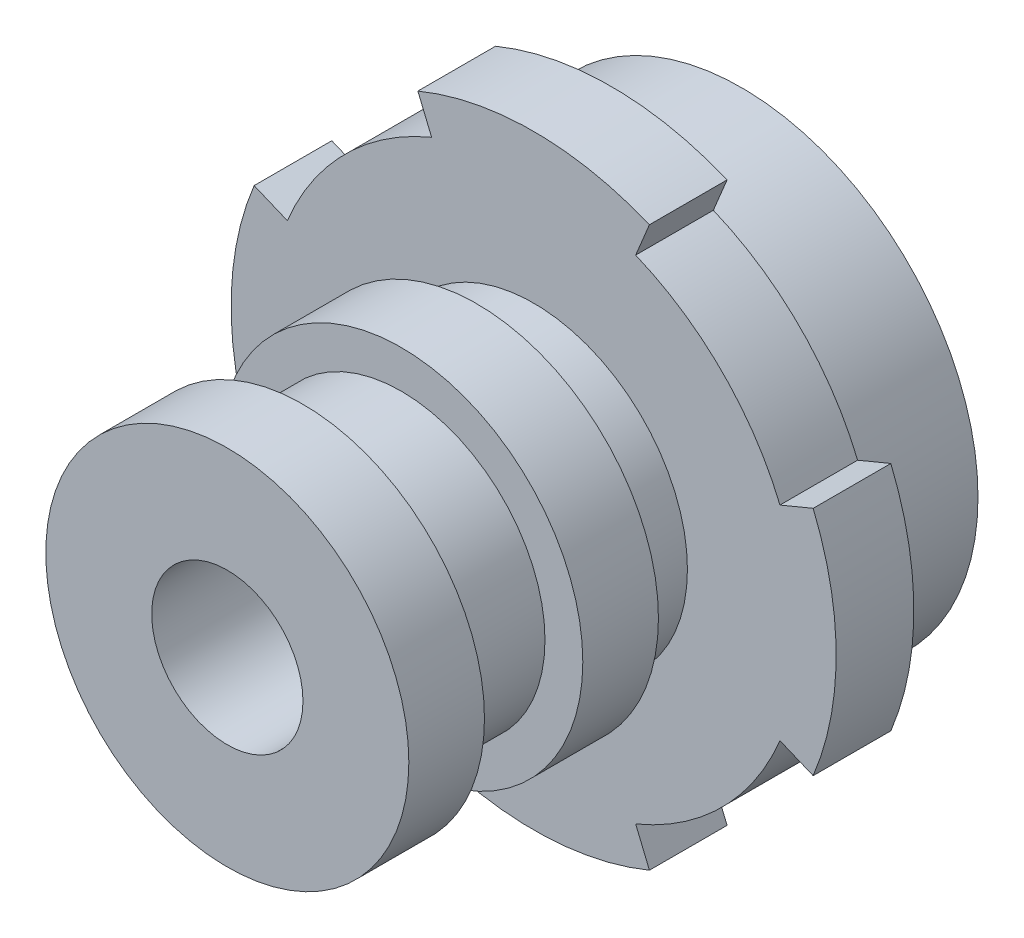
ISO-10303-21;
HEADER;
FILE_DESCRIPTION(('STEP AP214'),'2;1');
FILE_NAME('part.step','',(''),(''),'','','');
FILE_SCHEMA(('AUTOMOTIVE_DESIGN { 1 0 10303 214 1 1 1 1 }'));
ENDSEC;
DATA;
#1=APPLICATION_CONTEXT('core data for automotive mechanical design processes');
#2=APPLICATION_PROTOCOL_DEFINITION('international standard','automotive_design',2000,#1);
#3=PRODUCT_CONTEXT('',#1,'mechanical');
#4=PRODUCT('Part','Part','',(#3));
#5=PRODUCT_RELATED_PRODUCT_CATEGORY('part','',(#4));
#6=PRODUCT_DEFINITION_FORMATION('','',#4);
#7=PRODUCT_DEFINITION_CONTEXT('part definition',#1,'design');
#8=PRODUCT_DEFINITION('design','',#6,#7);
#9=PRODUCT_DEFINITION_SHAPE('','',#8);
#10=(LENGTH_UNIT() NAMED_UNIT(*) SI_UNIT(.MILLI.,.METRE.));
#11=(NAMED_UNIT(*) PLANE_ANGLE_UNIT() SI_UNIT($,.RADIAN.));
#12=(NAMED_UNIT(*) SI_UNIT($,.STERADIAN.) SOLID_ANGLE_UNIT());
#13=UNCERTAINTY_MEASURE_WITH_UNIT(LENGTH_MEASURE(1.E-05),#10,'distance_accuracy_value','');
#14=(GEOMETRIC_REPRESENTATION_CONTEXT(3) GLOBAL_UNCERTAINTY_ASSIGNED_CONTEXT((#13)) GLOBAL_UNIT_ASSIGNED_CONTEXT((#10,
#11,#12)) REPRESENTATION_CONTEXT('',''));
#15=CARTESIAN_POINT('',(0.,0.,0.));
#16=DIRECTION('',(0.,0.,1.));
#17=DIRECTION('',(1.,0.,0.));
#18=AXIS2_PLACEMENT_3D('',#15,#16,#17);
#19=CARTESIAN_POINT('',(0.,62.5,-60.7179487179488));
#20=DIRECTION('',(0.,0.,1.));
#21=DIRECTION('',(1.,0.,0.));
#22=AXIS2_PLACEMENT_3D('',#19,#20,#21);
#23=PLANE('',#22);
#24=CARTESIAN_POINT('',(0.,0.,-60.7179487179488));
#25=DIRECTION('',(0.,0.,1.));
#26=DIRECTION('',(1.,0.,0.));
#27=AXIS2_PLACEMENT_3D('',#24,#25,#26);
#28=CIRCLE('',#27,62.5);
#29=CARTESIAN_POINT('',(62.5,0.,-60.7179487179488));
#30=VERTEX_POINT('',#29);
#31=EDGE_CURVE('E306',#30,#30,#28,.T.);
#32=ORIENTED_EDGE('',*,*,#31,.T.);
#33=EDGE_LOOP('',(#32));
#34=FACE_BOUND('',#33,.T.);
#35=DIRECTION('',(-0.923879532511288,-0.382683432365087,0.));
#36=VECTOR('',#35,1.);
#37=CARTESIAN_POINT('',(0.,0.,-60.7179487179488));
#38=LINE('',#37,#36);
#39=CARTESIAN_POINT('',(-65.1335070420458,-26.9791819817386,-60.7179487179488));
#40=VERTEX_POINT('',#39);
#41=CARTESIAN_POINT('',(-73.910362600903,-30.614674589207,-60.7179487179488));
#42=VERTEX_POINT('',#41);
#43=EDGE_CURVE('E167',#40,#42,#38,.T.);
#44=ORIENTED_EDGE('',*,*,#43,.T.);
#45=CARTESIAN_POINT('',(0.,0.,-60.7179487179488));
#46=DIRECTION('',(0.,0.,1.));
#47=DIRECTION('',(1.,0.,0.));
#48=AXIS2_PLACEMENT_3D('',#45,#46,#47);
#49=CIRCLE('',#48,80.);
#50=CARTESIAN_POINT('',(-73.9103626009029,30.6146745892072,-60.7179487179488));
#51=VERTEX_POINT('',#50);
#52=EDGE_CURVE('E302',#51,#42,#49,.T.);
#53=ORIENTED_EDGE('',*,*,#52,.F.);
#54=DIRECTION('',(-0.923879532511287,0.38268343236509,0.));
#55=VECTOR('',#54,1.);
#56=CARTESIAN_POINT('',(0.,0.,-60.7179487179488));
#57=LINE('',#56,#55);
#58=CARTESIAN_POINT('',(-65.1335070420457,26.9791819817389,-60.7179487179488));
#59=VERTEX_POINT('',#58);
#60=EDGE_CURVE('E242',#59,#51,#57,.T.);
#61=ORIENTED_EDGE('',*,*,#60,.F.);
#62=CARTESIAN_POINT('',(0.,0.,-60.7179487179488));
#63=DIRECTION('',(0.,0.,-1.));
#64=DIRECTION('',(-1.,0.,0.));
#65=AXIS2_PLACEMENT_3D('',#62,#63,#64);
#66=CIRCLE('',#65,70.5);
#67=CARTESIAN_POINT('',(-26.9791819817384,65.1335070420459,-60.7179487179488));
#68=VERTEX_POINT('',#67);
#69=EDGE_CURVE('E191',#59,#68,#66,.T.);
#70=ORIENTED_EDGE('',*,*,#69,.T.);
#71=DIRECTION('',(-0.382683432365084,0.923879532511289,0.));
#72=VECTOR('',#71,1.);
#73=CARTESIAN_POINT('',(0.,0.,-60.7179487179488));
#74=LINE('',#73,#72);
#75=CARTESIAN_POINT('',(-30.6146745892067,73.9103626009031,-60.7179487179488));
#76=VERTEX_POINT('',#75);
#77=EDGE_CURVE('E245',#68,#76,#74,.T.);
#78=ORIENTED_EDGE('',*,*,#77,.T.);
#79=CARTESIAN_POINT('',(30.6146745892065,73.9103626009032,-60.7179487179488));
#80=VERTEX_POINT('',#79);
#81=EDGE_CURVE('E300',#80,#76,#49,.T.);
#82=ORIENTED_EDGE('',*,*,#81,.F.);
#83=DIRECTION('',(0.382683432365081,0.923879532511291,0.));
#84=VECTOR('',#83,1.);
#85=CARTESIAN_POINT('',(0.,0.,-60.7179487179488));
#86=LINE('',#85,#84);
#87=CARTESIAN_POINT('',(26.9791819817382,65.133507042046,-60.7179487179488));
#88=VERTEX_POINT('',#87);
#89=EDGE_CURVE('E222',#88,#80,#86,.T.);
#90=ORIENTED_EDGE('',*,*,#89,.F.);
#91=CARTESIAN_POINT('',(0.,0.,-60.7179487179488));
#92=DIRECTION('',(0.,0.,-1.));
#93=DIRECTION('',(0.,1.,0.));
#94=AXIS2_PLACEMENT_3D('',#91,#92,#93);
#95=CIRCLE('',#94,70.5);
#96=CARTESIAN_POINT('',(65.1335070420456,26.9791819817391,-60.7179487179488));
#97=VERTEX_POINT('',#96);
#98=EDGE_CURVE('E218',#88,#97,#95,.T.);
#99=ORIENTED_EDGE('',*,*,#98,.T.);
#100=DIRECTION('',(0.923879532511285,0.382683432365094,0.));
#101=VECTOR('',#100,1.);
#102=CARTESIAN_POINT('',(0.,0.,-60.7179487179488));
#103=LINE('',#102,#101);
#104=CARTESIAN_POINT('',(73.9103626009028,30.6146745892075,-60.7179487179488));
#105=VERTEX_POINT('',#104);
#106=EDGE_CURVE('E225',#97,#105,#103,.T.);
#107=ORIENTED_EDGE('',*,*,#106,.T.);
#108=CARTESIAN_POINT('',(73.9103626009029,-30.6146745892072,-60.7179487179488));
#109=VERTEX_POINT('',#108);
#110=EDGE_CURVE('E389',#109,#105,#49,.T.);
#111=ORIENTED_EDGE('',*,*,#110,.F.);
#112=DIRECTION('',(0.923879532511287,-0.38268343236509,0.));
#113=VECTOR('',#112,1.);
#114=CARTESIAN_POINT('',(0.,0.,-60.7179487179488));
#115=LINE('',#114,#113);
#116=CARTESIAN_POINT('',(65.1335070420457,-26.9791819817389,-60.7179487179488));
#117=VERTEX_POINT('',#116);
#118=EDGE_CURVE('E201',#117,#109,#115,.T.);
#119=ORIENTED_EDGE('',*,*,#118,.F.);
#120=CARTESIAN_POINT('',(0.,0.,-60.7179487179488));
#121=DIRECTION('',(0.,0.,-1.));
#122=DIRECTION('',(1.,0.,0.));
#123=AXIS2_PLACEMENT_3D('',#120,#121,#122);
#124=CIRCLE('',#123,70.5);
#125=CARTESIAN_POINT('',(26.9791819817384,-65.1335070420459,-60.7179487179488));
#126=VERTEX_POINT('',#125);
#127=EDGE_CURVE('E197',#117,#126,#124,.T.);
#128=ORIENTED_EDGE('',*,*,#127,.T.);
#129=DIRECTION('',(0.382683432365084,-0.923879532511289,0.));
#130=VECTOR('',#129,1.);
#131=CARTESIAN_POINT('',(0.,0.,-60.7179487179488));
#132=LINE('',#131,#130);
#133=CARTESIAN_POINT('',(30.6146745892067,-73.9103626009031,-60.7179487179488));
#134=VERTEX_POINT('',#133);
#135=EDGE_CURVE('E205',#126,#134,#132,.T.);
#136=ORIENTED_EDGE('',*,*,#135,.T.);
#137=CARTESIAN_POINT('',(-30.614674589207,-73.910362600903,-60.7179487179488));
#138=VERTEX_POINT('',#137);
#139=EDGE_CURVE('E183',#138,#134,#49,.T.);
#140=ORIENTED_EDGE('',*,*,#139,.F.);
#141=DIRECTION('',(-0.382683432365087,-0.923879532511288,0.));
#142=VECTOR('',#141,1.);
#143=CARTESIAN_POINT('',(0.,0.,-60.7179487179488));
#144=LINE('',#143,#142);
#145=CARTESIAN_POINT('',(-26.9791819817387,-65.1335070420458,-60.7179487179488));
#146=VERTEX_POINT('',#145);
#147=EDGE_CURVE('E159',#146,#138,#144,.T.);
#148=ORIENTED_EDGE('',*,*,#147,.F.);
#149=CARTESIAN_POINT('',(0.,0.,-60.7179487179488));
#150=DIRECTION('',(0.,0.,-1.));
#151=DIRECTION('',(0.,-1.,0.));
#152=AXIS2_PLACEMENT_3D('',#149,#150,#151);
#153=CIRCLE('',#152,70.5);
#154=EDGE_CURVE('E170',#146,#40,#153,.T.);
#155=ORIENTED_EDGE('',*,*,#154,.T.);
#156=EDGE_LOOP('',(#44,#53,#61,#70,#78,#82,#90,#99,#107,#111,#119,#128,#136,#140,#148,#155));
#157=FACE_BOUND('',#156,.T.);
#158=ADVANCED_FACE('F43',(#34,#157),#23,.F.);
#159=CARTESIAN_POINT('',(0.,0.,49.0256410256411));
#160=DIRECTION('',(0.,0.,1.));
#161=DIRECTION('',(1.,0.,0.));
#162=AXIS2_PLACEMENT_3D('',#159,#160,#161);
#163=CYLINDRICAL_SURFACE('',#162,80.);
#164=DIRECTION('',(0.,0.,-1.));
#165=VECTOR('',#164,1.);
#166=CARTESIAN_POINT('',(-73.910362600903,-30.614674589207,40.8205128205129));
#167=LINE('',#166,#165);
#168=CARTESIAN_POINT('',(-73.910362600903,-30.614674589207,-40.1794871794872));
#169=VERTEX_POINT('',#168);
#170=EDGE_CURVE('E192',#169,#42,#167,.T.);
#171=ORIENTED_EDGE('',*,*,#170,.F.);
#172=CARTESIAN_POINT('',(0.,0.,-40.1794871794871));
#173=DIRECTION('',(0.,0.,1.));
#174=DIRECTION('',(1.,0.,0.));
#175=AXIS2_PLACEMENT_3D('',#172,#173,#174);
#176=CIRCLE('',#175,80.);
#177=CARTESIAN_POINT('',(-73.9103626009029,30.6146745892072,-40.1794871794871));
#178=VERTEX_POINT('',#177);
#179=EDGE_CURVE('E296',#178,#169,#176,.T.);
#180=ORIENTED_EDGE('',*,*,#179,.F.);
#181=DIRECTION('',(0.,0.,-1.));
#182=VECTOR('',#181,1.);
#183=CARTESIAN_POINT('',(-73.9103626009029,30.6146745892072,40.8205128205129));
#184=LINE('',#183,#182);
#185=EDGE_CURVE('E258',#178,#51,#184,.T.);
#186=ORIENTED_EDGE('',*,*,#185,.T.);
#187=ORIENTED_EDGE('',*,*,#52,.T.);
#188=EDGE_LOOP('',(#171,#180,#186,#187));
#189=FACE_BOUND('',#188,.T.);
#190=ADVANCED_FACE('F370',(#189),#163,.T.);
#191=CARTESIAN_POINT('',(-30.614674589207,-73.910362600903,-40.1794871794871));
#192=VERTEX_POINT('',#191);
#193=CARTESIAN_POINT('',(30.6146745892067,-73.9103626009031,-40.1794871794872));
#194=VERTEX_POINT('',#193);
#195=EDGE_CURVE('E301',#192,#194,#176,.T.);
#196=ORIENTED_EDGE('',*,*,#195,.F.);
#197=DIRECTION('',(0.,0.,-1.));
#198=VECTOR('',#197,1.);
#199=CARTESIAN_POINT('',(-30.614674589207,-73.910362600903,40.8205128205129));
#200=LINE('',#199,#198);
#201=EDGE_CURVE('E166',#192,#138,#200,.T.);
#202=ORIENTED_EDGE('',*,*,#201,.T.);
#203=ORIENTED_EDGE('',*,*,#139,.T.);
#204=DIRECTION('',(0.,0.,-1.));
#205=VECTOR('',#204,1.);
#206=CARTESIAN_POINT('',(30.6146745892067,-73.9103626009031,40.8205128205129));
#207=LINE('',#206,#205);
#208=EDGE_CURVE('E211',#194,#134,#207,.T.);
#209=ORIENTED_EDGE('',*,*,#208,.F.);
#210=EDGE_LOOP('',(#196,#202,#203,#209));
#211=FACE_BOUND('',#210,.T.);
#212=ADVANCED_FACE('F399',(#211),#163,.T.);
#213=CARTESIAN_POINT('',(73.9103626009029,-30.6146745892072,-40.1794871794871));
#214=VERTEX_POINT('',#213);
#215=CARTESIAN_POINT('',(73.9103626009028,30.6146745892075,-40.1794871794872));
#216=VERTEX_POINT('',#215);
#217=EDGE_CURVE('E404',#214,#216,#176,.T.);
#218=ORIENTED_EDGE('',*,*,#217,.F.);
#219=DIRECTION('',(0.,0.,-1.));
#220=VECTOR('',#219,1.);
#221=CARTESIAN_POINT('',(73.9103626009029,-30.6146745892072,40.8205128205129));
#222=LINE('',#221,#220);
#223=EDGE_CURVE('E67',#214,#109,#222,.T.);
#224=ORIENTED_EDGE('',*,*,#223,.T.);
#225=ORIENTED_EDGE('',*,*,#110,.T.);
#226=DIRECTION('',(0.,0.,-1.));
#227=VECTOR('',#226,1.);
#228=CARTESIAN_POINT('',(73.9103626009028,30.6146745892075,40.8205128205129));
#229=LINE('',#228,#227);
#230=EDGE_CURVE('E232',#216,#105,#229,.T.);
#231=ORIENTED_EDGE('',*,*,#230,.F.);
#232=EDGE_LOOP('',(#218,#224,#225,#231));
#233=FACE_BOUND('',#232,.T.);
#234=ADVANCED_FACE('F415',(#233),#163,.T.);
#235=CARTESIAN_POINT('',(0.,80.,-40.1794871794871));
#236=DIRECTION('',(0.,0.,-1.));
#237=DIRECTION('',(-1.,0.,0.));
#238=AXIS2_PLACEMENT_3D('',#235,#236,#237);
#239=PLANE('',#238);
#240=CARTESIAN_POINT('',(0.,0.,-40.1794871794871));
#241=DIRECTION('',(0.,0.,1.));
#242=DIRECTION('',(1.,0.,0.));
#243=AXIS2_PLACEMENT_3D('',#240,#241,#242);
#244=CIRCLE('',#243,40.6666666666667);
#245=CARTESIAN_POINT('',(40.6666666666667,0.,-40.1794871794871));
#246=VERTEX_POINT('',#245);
#247=EDGE_CURVE('E291',#246,#246,#244,.T.);
#248=ORIENTED_EDGE('',*,*,#247,.F.);
#249=EDGE_LOOP('',(#248));
#250=FACE_BOUND('',#249,.T.);
#251=DIRECTION('',(-0.923879532511288,-0.382683432365087,0.));
#252=VECTOR('',#251,1.);
#253=CARTESIAN_POINT('',(28.2842712474617,11.7157287525379,-40.1794871794871));
#254=LINE('',#253,#252);
#255=CARTESIAN_POINT('',(-65.1335070420458,-26.9791819817386,-40.1794871794872));
#256=VERTEX_POINT('',#255);
#257=EDGE_CURVE('E11',#256,#169,#254,.T.);
#258=ORIENTED_EDGE('',*,*,#257,.F.);
#259=CARTESIAN_POINT('',(0.,0.,-40.1794871794872));
#260=DIRECTION('',(0.,0.,-1.));
#261=DIRECTION('',(-1.,0.,0.));
#262=AXIS2_PLACEMENT_3D('',#259,#260,#261);
#263=CIRCLE('',#262,70.5);
#264=CARTESIAN_POINT('',(-26.9791819817387,-65.1335070420458,-40.1794871794872));
#265=VERTEX_POINT('',#264);
#266=EDGE_CURVE('E52',#265,#256,#263,.T.);
#267=ORIENTED_EDGE('',*,*,#266,.F.);
#268=DIRECTION('',(-0.382683432365087,-0.923879532511288,0.));
#269=VECTOR('',#268,1.);
#270=CARTESIAN_POINT('',(28.2842712474617,68.2842712474621,-40.1794871794871));
#271=LINE('',#270,#269);
#272=EDGE_CURVE('E162',#265,#192,#271,.T.);
#273=ORIENTED_EDGE('',*,*,#272,.T.);
#274=ORIENTED_EDGE('',*,*,#195,.T.);
#275=DIRECTION('',(0.382683432365084,-0.923879532511289,0.));
#276=VECTOR('',#275,1.);
#277=CARTESIAN_POINT('',(-28.2842712474615,68.2842712474623,-40.1794871794871));
#278=LINE('',#277,#276);
#279=CARTESIAN_POINT('',(26.9791819817384,-65.1335070420459,-40.1794871794872));
#280=VERTEX_POINT('',#279);
#281=EDGE_CURVE('E356',#280,#194,#278,.T.);
#282=ORIENTED_EDGE('',*,*,#281,.F.);
#283=CARTESIAN_POINT('',(0.,0.,-40.1794871794872));
#284=DIRECTION('',(0.,0.,-1.));
#285=DIRECTION('',(-1.,0.,0.));
#286=AXIS2_PLACEMENT_3D('',#283,#284,#285);
#287=CIRCLE('',#286,70.5);
#288=CARTESIAN_POINT('',(65.1335070420457,-26.9791819817389,-40.1794871794872));
#289=VERTEX_POINT('',#288);
#290=EDGE_CURVE('E353',#289,#280,#287,.T.);
#291=ORIENTED_EDGE('',*,*,#290,.F.);
#292=DIRECTION('',(0.923879532511287,-0.38268343236509,0.));
#293=VECTOR('',#292,1.);
#294=CARTESIAN_POINT('',(-28.2842712474619,11.7157287525381,-40.1794871794871));
#295=LINE('',#294,#293);
#296=EDGE_CURVE('E350',#289,#214,#295,.T.);
#297=ORIENTED_EDGE('',*,*,#296,.T.);
#298=ORIENTED_EDGE('',*,*,#217,.T.);
#299=DIRECTION('',(0.923879532511285,0.382683432365094,0.));
#300=VECTOR('',#299,1.);
#301=CARTESIAN_POINT('',(28.2842712474621,11.7157287525383,-40.1794871794871));
#302=LINE('',#301,#300);
#303=CARTESIAN_POINT('',(65.1335070420456,26.9791819817391,-40.1794871794872));
#304=VERTEX_POINT('',#303);
#305=EDGE_CURVE('E347',#304,#216,#302,.T.);
#306=ORIENTED_EDGE('',*,*,#305,.F.);
#307=CARTESIAN_POINT('',(0.,0.,-40.1794871794872));
#308=DIRECTION('',(0.,0.,-1.));
#309=DIRECTION('',(-1.,0.,0.));
#310=AXIS2_PLACEMENT_3D('',#307,#308,#309);
#311=CIRCLE('',#310,70.5);
#312=CARTESIAN_POINT('',(26.9791819817382,65.133507042046,-40.1794871794872));
#313=VERTEX_POINT('',#312);
#314=EDGE_CURVE('E344',#313,#304,#311,.T.);
#315=ORIENTED_EDGE('',*,*,#314,.F.);
#316=DIRECTION('',(0.382683432365081,0.923879532511291,0.));
#317=VECTOR('',#316,1.);
#318=CARTESIAN_POINT('',(28.2842712474614,68.2842712474625,-40.1794871794871));
#319=LINE('',#318,#317);
#320=CARTESIAN_POINT('',(30.6146745892065,73.9103626009032,-40.1794871794871));
#321=VERTEX_POINT('',#320);
#322=EDGE_CURVE('E341',#313,#321,#319,.T.);
#323=ORIENTED_EDGE('',*,*,#322,.T.);
#324=CARTESIAN_POINT('',(-30.6146745892067,73.9103626009031,-40.1794871794872));
#325=VERTEX_POINT('',#324);
#326=EDGE_CURVE('E295',#321,#325,#176,.T.);
#327=ORIENTED_EDGE('',*,*,#326,.T.);
#328=DIRECTION('',(-0.382683432365084,0.923879532511289,0.));
#329=VECTOR('',#328,1.);
#330=CARTESIAN_POINT('',(-28.2842712474615,68.2842712474623,-40.1794871794871));
#331=LINE('',#330,#329);
#332=CARTESIAN_POINT('',(-26.9791819817384,65.1335070420459,-40.1794871794872));
#333=VERTEX_POINT('',#332);
#334=EDGE_CURVE('E337',#333,#325,#331,.T.);
#335=ORIENTED_EDGE('',*,*,#334,.F.);
#336=CARTESIAN_POINT('',(0.,0.,-40.1794871794872));
#337=DIRECTION('',(0.,0.,-1.));
#338=DIRECTION('',(-1.,0.,0.));
#339=AXIS2_PLACEMENT_3D('',#336,#337,#338);
#340=CIRCLE('',#339,70.5);
#341=CARTESIAN_POINT('',(-65.1335070420457,26.9791819817389,-40.1794871794872));
#342=VERTEX_POINT('',#341);
#343=EDGE_CURVE('E334',#342,#333,#340,.T.);
#344=ORIENTED_EDGE('',*,*,#343,.F.);
#345=DIRECTION('',(-0.923879532511287,0.38268343236509,0.));
#346=VECTOR('',#345,1.);
#347=CARTESIAN_POINT('',(-28.2842712474619,11.7157287525381,-40.1794871794871));
#348=LINE('',#347,#346);
#349=EDGE_CURVE('E330',#342,#178,#348,.T.);
#350=ORIENTED_EDGE('',*,*,#349,.T.);
#351=ORIENTED_EDGE('',*,*,#179,.T.);
#352=EDGE_LOOP('',(#258,#267,#273,#274,#282,#291,#297,#298,#306,#315,#323,#327,#335,#344,#350,#351));
#353=FACE_BOUND('',#352,.T.);
#354=ADVANCED_FACE('F366',(#250,#353),#239,.F.);
#355=ORIENTED_EDGE('',*,*,#326,.F.);
#356=DIRECTION('',(0.,0.,-1.));
#357=VECTOR('',#356,1.);
#358=CARTESIAN_POINT('',(30.6146745892065,73.9103626009032,40.8205128205129));
#359=LINE('',#358,#357);
#360=EDGE_CURVE('E59',#321,#80,#359,.T.);
#361=ORIENTED_EDGE('',*,*,#360,.T.);
#362=ORIENTED_EDGE('',*,*,#81,.T.);
#363=DIRECTION('',(0.,0.,-1.));
#364=VECTOR('',#363,1.);
#365=CARTESIAN_POINT('',(-30.6146745892067,73.9103626009031,40.8205128205129));
#366=LINE('',#365,#364);
#367=EDGE_CURVE('E254',#325,#76,#366,.T.);
#368=ORIENTED_EDGE('',*,*,#367,.F.);
#369=EDGE_LOOP('',(#355,#361,#362,#368));
#370=FACE_BOUND('',#369,.T.);
#371=ADVANCED_FACE('F412',(#370),#163,.T.);
#372=CARTESIAN_POINT('',(0.,48.,40.8205128205129));
#373=DIRECTION('',(0.,0.,-1.));
#374=DIRECTION('',(-1.,0.,0.));
#375=AXIS2_PLACEMENT_3D('',#372,#373,#374);
#376=PLANE('',#375);
#377=CARTESIAN_POINT('',(0.,0.,40.8205128205129));
#378=DIRECTION('',(0.,0.,1.));
#379=DIRECTION('',(1.,0.,0.));
#380=AXIS2_PLACEMENT_3D('',#377,#378,#379);
#381=CIRCLE('',#380,20.);
#382=CARTESIAN_POINT('',(20.,0.,40.8205128205129));
#383=VERTEX_POINT('',#382);
#384=EDGE_CURVE('E326',#383,#383,#381,.T.);
#385=ORIENTED_EDGE('',*,*,#384,.F.);
#386=EDGE_LOOP('',(#385));
#387=FACE_BOUND('',#386,.T.);
#388=CARTESIAN_POINT('',(0.,0.,40.8205128205129));
#389=DIRECTION('',(0.,0.,1.));
#390=DIRECTION('',(1.,0.,0.));
#391=AXIS2_PLACEMENT_3D('',#388,#389,#390);
#392=CIRCLE('',#391,48.);
#393=CARTESIAN_POINT('',(48.,0.,40.8205128205129));
#394=VERTEX_POINT('',#393);
#395=EDGE_CURVE('E253',#394,#394,#392,.T.);
#396=ORIENTED_EDGE('',*,*,#395,.T.);
#397=EDGE_LOOP('',(#396));
#398=FACE_BOUND('',#397,.T.);
#399=ADVANCED_FACE('F45',(#387,#398),#376,.F.);
#400=CARTESIAN_POINT('',(0.,0.,49.0256410256411));
#401=DIRECTION('',(0.,0.,1.));
#402=DIRECTION('',(1.,0.,0.));
#403=AXIS2_PLACEMENT_3D('',#400,#401,#402);
#404=CYLINDRICAL_SURFACE('',#403,20.);
#405=CARTESIAN_POINT('',(0.,0.,-65.1794871794871));
#406=DIRECTION('',(0.,0.,1.));
#407=DIRECTION('',(1.,0.,0.));
#408=AXIS2_PLACEMENT_3D('',#405,#406,#407);
#409=CIRCLE('',#408,20.);
#410=CARTESIAN_POINT('',(20.,0.,-65.1794871794871));
#411=VERTEX_POINT('',#410);
#412=EDGE_CURVE('E322',#411,#411,#409,.T.);
#413=ORIENTED_EDGE('',*,*,#412,.F.);
#414=EDGE_LOOP('',(#413));
#415=FACE_BOUND('',#414,.T.);
#416=ORIENTED_EDGE('',*,*,#384,.T.);
#417=EDGE_LOOP('',(#416));
#418=FACE_BOUND('',#417,.T.);
#419=ADVANCED_FACE('F420',(#415,#418),#404,.F.);
#420=CARTESIAN_POINT('',(0.,20.,-65.1794871794871));
#421=DIRECTION('',(0.,0.,1.));
#422=DIRECTION('',(1.,0.,0.));
#423=AXIS2_PLACEMENT_3D('',#420,#421,#422);
#424=PLANE('',#423);
#425=CARTESIAN_POINT('',(0.,0.,-65.1794871794871));
#426=DIRECTION('',(0.,0.,1.));
#427=DIRECTION('',(1.,0.,0.));
#428=AXIS2_PLACEMENT_3D('',#425,#426,#427);
#429=CIRCLE('',#428,48.);
#430=CARTESIAN_POINT('',(48.,0.,-65.1794871794871));
#431=VERTEX_POINT('',#430);
#432=EDGE_CURVE('E318',#431,#431,#429,.T.);
#433=ORIENTED_EDGE('',*,*,#432,.F.);
#434=EDGE_LOOP('',(#433));
#435=FACE_BOUND('',#434,.T.);
#436=ORIENTED_EDGE('',*,*,#412,.T.);
#437=EDGE_LOOP('',(#436));
#438=FACE_BOUND('',#437,.T.);
#439=ADVANCED_FACE('F444',(#435,#438),#424,.F.);
#440=CARTESIAN_POINT('',(0.,0.,49.0256410256411));
#441=DIRECTION('',(0.,0.,1.));
#442=DIRECTION('',(1.,0.,0.));
#443=AXIS2_PLACEMENT_3D('',#440,#441,#442);
#444=CYLINDRICAL_SURFACE('',#443,48.);
#445=CARTESIAN_POINT('',(0.,0.,-95.1794871794871));
#446=DIRECTION('',(0.,0.,1.));
#447=DIRECTION('',(1.,0.,0.));
#448=AXIS2_PLACEMENT_3D('',#445,#446,#447);
#449=CIRCLE('',#448,48.);
#450=CARTESIAN_POINT('',(48.,0.,-95.1794871794871));
#451=VERTEX_POINT('',#450);
#452=EDGE_CURVE('E314',#451,#451,#449,.T.);
#453=ORIENTED_EDGE('',*,*,#452,.F.);
#454=EDGE_LOOP('',(#453));
#455=FACE_BOUND('',#454,.T.);
#456=ORIENTED_EDGE('',*,*,#432,.T.);
#457=EDGE_LOOP('',(#456));
#458=FACE_BOUND('',#457,.T.);
#459=ADVANCED_FACE('F440',(#455,#458),#444,.F.);
#460=CARTESIAN_POINT('',(0.,48.,-95.1794871794871));
#461=DIRECTION('',(0.,0.,1.));
#462=DIRECTION('',(1.,0.,0.));
#463=AXIS2_PLACEMENT_3D('',#460,#461,#462);
#464=PLANE('',#463);
#465=CARTESIAN_POINT('',(0.,0.,-95.1794871794871));
#466=DIRECTION('',(0.,0.,1.));
#467=DIRECTION('',(1.,0.,0.));
#468=AXIS2_PLACEMENT_3D('',#465,#466,#467);
#469=CIRCLE('',#468,62.5);
#470=CARTESIAN_POINT('',(62.5,0.,-95.1794871794871));
#471=VERTEX_POINT('',#470);
#472=EDGE_CURVE('E310',#471,#471,#469,.T.);
#473=ORIENTED_EDGE('',*,*,#472,.F.);
#474=EDGE_LOOP('',(#473));
#475=FACE_BOUND('',#474,.T.);
#476=ORIENTED_EDGE('',*,*,#452,.T.);
#477=EDGE_LOOP('',(#476));
#478=FACE_BOUND('',#477,.T.);
#479=ADVANCED_FACE('F436',(#475,#478),#464,.F.);
#480=CARTESIAN_POINT('',(0.,0.,49.0256410256411));
#481=DIRECTION('',(0.,0.,1.));
#482=DIRECTION('',(1.,0.,0.));
#483=AXIS2_PLACEMENT_3D('',#480,#481,#482);
#484=CYLINDRICAL_SURFACE('',#483,62.5);
#485=ORIENTED_EDGE('',*,*,#31,.F.);
#486=EDGE_LOOP('',(#485));
#487=FACE_BOUND('',#486,.T.);
#488=ORIENTED_EDGE('',*,*,#472,.T.);
#489=EDGE_LOOP('',(#488));
#490=FACE_BOUND('',#489,.T.);
#491=ADVANCED_FACE('F432',(#487,#490),#484,.T.);
#492=CARTESIAN_POINT('',(0.,0.,49.0256410256411));
#493=DIRECTION('',(0.,0.,1.));
#494=DIRECTION('',(1.,0.,0.));
#495=AXIS2_PLACEMENT_3D('',#492,#493,#494);
#496=CYLINDRICAL_SURFACE('',#495,40.6666666666667);
#497=CARTESIAN_POINT('',(0.,0.,-25.1794871794871));
#498=DIRECTION('',(0.,0.,1.));
#499=DIRECTION('',(1.,0.,0.));
#500=AXIS2_PLACEMENT_3D('',#497,#498,#499);
#501=CIRCLE('',#500,40.6666666666667);
#502=CARTESIAN_POINT('',(40.6666666666667,0.,-25.1794871794871));
#503=VERTEX_POINT('',#502);
#504=EDGE_CURVE('E287',#503,#503,#501,.T.);
#505=ORIENTED_EDGE('',*,*,#504,.F.);
#506=EDGE_LOOP('',(#505));
#507=FACE_BOUND('',#506,.T.);
#508=ORIENTED_EDGE('',*,*,#247,.T.);
#509=EDGE_LOOP('',(#508));
#510=FACE_BOUND('',#509,.T.);
#511=ADVANCED_FACE('F435',(#507,#510),#496,.T.);
#512=CARTESIAN_POINT('',(0.,40.6666666666667,-25.1794871794871));
#513=DIRECTION('',(0.,0.,1.));
#514=DIRECTION('',(1.,0.,0.));
#515=AXIS2_PLACEMENT_3D('',#512,#513,#514);
#516=PLANE('',#515);
#517=CARTESIAN_POINT('',(0.,0.,-25.1794871794871));
#518=DIRECTION('',(0.,0.,1.));
#519=DIRECTION('',(1.,0.,0.));
#520=AXIS2_PLACEMENT_3D('',#517,#518,#519);
#521=CIRCLE('',#520,48.);
#522=CARTESIAN_POINT('',(48.,0.,-25.1794871794871));
#523=VERTEX_POINT('',#522);
#524=EDGE_CURVE('E283',#523,#523,#521,.T.);
#525=ORIENTED_EDGE('',*,*,#524,.F.);
#526=EDGE_LOOP('',(#525));
#527=FACE_BOUND('',#526,.T.);
#528=ORIENTED_EDGE('',*,*,#504,.T.);
#529=EDGE_LOOP('',(#528));
#530=FACE_BOUND('',#529,.T.);
#531=ADVANCED_FACE('F485',(#527,#530),#516,.F.);
#532=CARTESIAN_POINT('',(0.,0.,49.0256410256411));
#533=DIRECTION('',(0.,0.,1.));
#534=DIRECTION('',(1.,0.,0.));
#535=AXIS2_PLACEMENT_3D('',#532,#533,#534);
#536=CYLINDRICAL_SURFACE('',#535,48.);
#537=CARTESIAN_POINT('',(0.,0.,-5.17948717948714));
#538=DIRECTION('',(0.,0.,1.));
#539=DIRECTION('',(1.,0.,0.));
#540=AXIS2_PLACEMENT_3D('',#537,#538,#539);
#541=CIRCLE('',#540,48.);
#542=CARTESIAN_POINT('',(48.,0.,-5.17948717948714));
#543=VERTEX_POINT('',#542);
#544=EDGE_CURVE('E279',#543,#543,#541,.T.);
#545=ORIENTED_EDGE('',*,*,#544,.F.);
#546=EDGE_LOOP('',(#545));
#547=FACE_BOUND('',#546,.T.);
#548=ORIENTED_EDGE('',*,*,#524,.T.);
#549=EDGE_LOOP('',(#548));
#550=FACE_BOUND('',#549,.T.);
#551=ADVANCED_FACE('F479',(#547,#550),#536,.T.);
#552=CARTESIAN_POINT('',(0.,48.,-5.17948717948714));
#553=DIRECTION('',(0.,0.,-1.));
#554=DIRECTION('',(-1.,0.,0.));
#555=AXIS2_PLACEMENT_3D('',#552,#553,#554);
#556=PLANE('',#555);
#557=CARTESIAN_POINT('',(0.,0.,-5.17948717948714));
#558=DIRECTION('',(0.,0.,1.));
#559=DIRECTION('',(1.,0.,0.));
#560=AXIS2_PLACEMENT_3D('',#557,#558,#559);
#561=CIRCLE('',#560,38.);
#562=CARTESIAN_POINT('',(38.,0.,-5.17948717948714));
#563=VERTEX_POINT('',#562);
#564=EDGE_CURVE('E275',#563,#563,#561,.T.);
#565=ORIENTED_EDGE('',*,*,#564,.F.);
#566=EDGE_LOOP('',(#565));
#567=FACE_BOUND('',#566,.T.);
#568=ORIENTED_EDGE('',*,*,#544,.T.);
#569=EDGE_LOOP('',(#568));
#570=FACE_BOUND('',#569,.T.);
#571=ADVANCED_FACE('F473',(#567,#570),#556,.F.);
#572=CARTESIAN_POINT('',(0.,0.,49.0256410256411));
#573=DIRECTION('',(0.,0.,1.));
#574=DIRECTION('',(1.,0.,0.));
#575=AXIS2_PLACEMENT_3D('',#572,#573,#574);
#576=CYLINDRICAL_SURFACE('',#575,38.);
#577=CARTESIAN_POINT('',(0.,0.,20.8205128205129));
#578=DIRECTION('',(0.,0.,1.));
#579=DIRECTION('',(1.,0.,0.));
#580=AXIS2_PLACEMENT_3D('',#577,#578,#579);
#581=CIRCLE('',#580,38.);
#582=CARTESIAN_POINT('',(38.,0.,20.8205128205129));
#583=VERTEX_POINT('',#582);
#584=EDGE_CURVE('E271',#583,#583,#581,.T.);
#585=ORIENTED_EDGE('',*,*,#584,.F.);
#586=EDGE_LOOP('',(#585));
#587=FACE_BOUND('',#586,.T.);
#588=ORIENTED_EDGE('',*,*,#564,.T.);
#589=EDGE_LOOP('',(#588));
#590=FACE_BOUND('',#589,.T.);
#591=ADVANCED_FACE('F467',(#587,#590),#576,.T.);
#592=CARTESIAN_POINT('',(0.,38.,20.8205128205129));
#593=DIRECTION('',(0.,0.,1.));
#594=DIRECTION('',(1.,0.,0.));
#595=AXIS2_PLACEMENT_3D('',#592,#593,#594);
#596=PLANE('',#595);
#597=CARTESIAN_POINT('',(0.,0.,20.8205128205129));
#598=DIRECTION('',(0.,0.,1.));
#599=DIRECTION('',(1.,0.,0.));
#600=AXIS2_PLACEMENT_3D('',#597,#598,#599);
#601=CIRCLE('',#600,48.);
#602=CARTESIAN_POINT('',(48.,0.,20.8205128205129));
#603=VERTEX_POINT('',#602);
#604=EDGE_CURVE('E267',#603,#603,#601,.T.);
#605=ORIENTED_EDGE('',*,*,#604,.F.);
#606=EDGE_LOOP('',(#605));
#607=FACE_BOUND('',#606,.T.);
#608=ORIENTED_EDGE('',*,*,#584,.T.);
#609=EDGE_LOOP('',(#608));
#610=FACE_BOUND('',#609,.T.);
#611=ADVANCED_FACE('F461',(#607,#610),#596,.F.);
#612=CARTESIAN_POINT('',(0.,0.,49.0256410256411));
#613=DIRECTION('',(0.,0.,1.));
#614=DIRECTION('',(1.,0.,0.));
#615=AXIS2_PLACEMENT_3D('',#612,#613,#614);
#616=CYLINDRICAL_SURFACE('',#615,48.);
#617=ORIENTED_EDGE('',*,*,#395,.F.);
#618=EDGE_LOOP('',(#617));
#619=FACE_BOUND('',#618,.T.);
#620=ORIENTED_EDGE('',*,*,#604,.T.);
#621=EDGE_LOOP('',(#620));
#622=FACE_BOUND('',#621,.T.);
#623=ADVANCED_FACE('F458',(#619,#622),#616,.T.);
#624=CARTESIAN_POINT('',(0.,0.,40.8205128205129));
#625=DIRECTION('',(0.,0.,-1.));
#626=DIRECTION('',(-1.,0.,0.));
#627=AXIS2_PLACEMENT_3D('',#624,#625,#626);
#628=CYLINDRICAL_SURFACE('',#627,70.5);
#629=ORIENTED_EDGE('',*,*,#343,.T.);
#630=DIRECTION('',(0.,0.,-1.));
#631=VECTOR('',#630,1.);
#632=CARTESIAN_POINT('',(-26.9791819817384,65.1335070420459,40.8205128205129));
#633=LINE('',#632,#631);
#634=EDGE_CURVE('E250',#333,#68,#633,.T.);
#635=ORIENTED_EDGE('',*,*,#634,.T.);
#636=ORIENTED_EDGE('',*,*,#69,.F.);
#637=DIRECTION('',(0.,0.,-1.));
#638=VECTOR('',#637,1.);
#639=CARTESIAN_POINT('',(-65.1335070420457,26.9791819817389,40.8205128205129));
#640=LINE('',#639,#638);
#641=EDGE_CURVE('E249',#342,#59,#640,.T.);
#642=ORIENTED_EDGE('',*,*,#641,.F.);
#643=EDGE_LOOP('',(#629,#635,#636,#642));
#644=FACE_BOUND('',#643,.T.);
#645=ADVANCED_FACE('F378',(#644),#628,.T.);
#646=CARTESIAN_POINT('',(0.,0.,40.8205128205129));
#647=DIRECTION('',(-0.923879532511289,-0.382683432365084,0.));
#648=DIRECTION('',(0.382683432365084,-0.923879532511289,0.));
#649=AXIS2_PLACEMENT_3D('',#646,#647,#648);
#650=PLANE('',#649);
#651=ORIENTED_EDGE('',*,*,#334,.T.);
#652=ORIENTED_EDGE('',*,*,#367,.T.);
#653=ORIENTED_EDGE('',*,*,#77,.F.);
#654=ORIENTED_EDGE('',*,*,#634,.F.);
#655=EDGE_LOOP('',(#651,#652,#653,#654));
#656=FACE_BOUND('',#655,.T.);
#657=ADVANCED_FACE('F383',(#656),#650,.T.);
#658=CARTESIAN_POINT('',(0.,0.,40.8205128205129));
#659=DIRECTION('',(-0.38268343236509,-0.923879532511287,0.));
#660=DIRECTION('',(0.923879532511287,-0.38268343236509,0.));
#661=AXIS2_PLACEMENT_3D('',#658,#659,#660);
#662=PLANE('',#661);
#663=ORIENTED_EDGE('',*,*,#641,.T.);
#664=ORIENTED_EDGE('',*,*,#60,.T.);
#665=ORIENTED_EDGE('',*,*,#185,.F.);
#666=ORIENTED_EDGE('',*,*,#349,.F.);
#667=EDGE_LOOP('',(#663,#664,#665,#666));
#668=FACE_BOUND('',#667,.T.);
#669=ADVANCED_FACE('F375',(#668),#662,.F.);
#670=CARTESIAN_POINT('',(0.,0.,40.8205128205129));
#671=DIRECTION('',(0.,0.,-1.));
#672=DIRECTION('',(-1.,0.,0.));
#673=AXIS2_PLACEMENT_3D('',#670,#671,#672);
#674=CYLINDRICAL_SURFACE('',#673,70.5);
#675=ORIENTED_EDGE('',*,*,#314,.T.);
#676=DIRECTION('',(0.,0.,-1.));
#677=VECTOR('',#676,1.);
#678=CARTESIAN_POINT('',(65.1335070420456,26.9791819817391,40.8205128205129));
#679=LINE('',#678,#677);
#680=EDGE_CURVE('E202',#304,#97,#679,.T.);
#681=ORIENTED_EDGE('',*,*,#680,.T.);
#682=ORIENTED_EDGE('',*,*,#98,.F.);
#683=DIRECTION('',(0.,0.,-1.));
#684=VECTOR('',#683,1.);
#685=CARTESIAN_POINT('',(26.9791819817382,65.133507042046,40.8205128205129));
#686=LINE('',#685,#684);
#687=EDGE_CURVE('E229',#313,#88,#686,.T.);
#688=ORIENTED_EDGE('',*,*,#687,.F.);
#689=EDGE_LOOP('',(#675,#681,#682,#688));
#690=FACE_BOUND('',#689,.T.);
#691=ADVANCED_FACE('F505',(#690),#674,.T.);
#692=CARTESIAN_POINT('',(0.,0.,40.8205128205129));
#693=DIRECTION('',(-0.382683432365094,0.923879532511285,0.));
#694=DIRECTION('',(-0.923879532511285,-0.382683432365094,0.));
#695=AXIS2_PLACEMENT_3D('',#692,#693,#694);
#696=PLANE('',#695);
#697=ORIENTED_EDGE('',*,*,#305,.T.);
#698=ORIENTED_EDGE('',*,*,#230,.T.);
#699=ORIENTED_EDGE('',*,*,#106,.F.);
#700=ORIENTED_EDGE('',*,*,#680,.F.);
#701=EDGE_LOOP('',(#697,#698,#699,#700));
#702=FACE_BOUND('',#701,.T.);
#703=ADVANCED_FACE('F510',(#702),#696,.T.);
#704=CARTESIAN_POINT('',(0.,0.,40.8205128205129));
#705=DIRECTION('',(-0.923879532511291,0.382683432365081,0.));
#706=DIRECTION('',(-0.382683432365081,-0.923879532511291,0.));
#707=AXIS2_PLACEMENT_3D('',#704,#705,#706);
#708=PLANE('',#707);
#709=ORIENTED_EDGE('',*,*,#687,.T.);
#710=ORIENTED_EDGE('',*,*,#89,.T.);
#711=ORIENTED_EDGE('',*,*,#360,.F.);
#712=ORIENTED_EDGE('',*,*,#322,.F.);
#713=EDGE_LOOP('',(#709,#710,#711,#712));
#714=FACE_BOUND('',#713,.T.);
#715=ADVANCED_FACE('F512',(#714),#708,.F.);
#716=CARTESIAN_POINT('',(0.,0.,40.8205128205129));
#717=DIRECTION('',(0.,0.,-1.));
#718=DIRECTION('',(-1.,0.,0.));
#719=AXIS2_PLACEMENT_3D('',#716,#717,#718);
#720=CYLINDRICAL_SURFACE('',#719,70.5);
#721=ORIENTED_EDGE('',*,*,#290,.T.);
#722=DIRECTION('',(0.,0.,-1.));
#723=VECTOR('',#722,1.);
#724=CARTESIAN_POINT('',(26.9791819817384,-65.1335070420459,40.8205128205129));
#725=LINE('',#724,#723);
#726=EDGE_CURVE('E178',#280,#126,#725,.T.);
#727=ORIENTED_EDGE('',*,*,#726,.T.);
#728=ORIENTED_EDGE('',*,*,#127,.F.);
#729=DIRECTION('',(0.,0.,-1.));
#730=VECTOR('',#729,1.);
#731=CARTESIAN_POINT('',(65.1335070420457,-26.9791819817389,40.8205128205129));
#732=LINE('',#731,#730);
#733=EDGE_CURVE('E208',#289,#117,#732,.T.);
#734=ORIENTED_EDGE('',*,*,#733,.F.);
#735=EDGE_LOOP('',(#721,#727,#728,#734));
#736=FACE_BOUND('',#735,.T.);
#737=ADVANCED_FACE('F515',(#736),#720,.T.);
#738=CARTESIAN_POINT('',(0.,0.,40.8205128205129));
#739=DIRECTION('',(0.923879532511289,0.382683432365084,0.));
#740=DIRECTION('',(-0.382683432365084,0.923879532511289,0.));
#741=AXIS2_PLACEMENT_3D('',#738,#739,#740);
#742=PLANE('',#741);
#743=ORIENTED_EDGE('',*,*,#281,.T.);
#744=ORIENTED_EDGE('',*,*,#208,.T.);
#745=ORIENTED_EDGE('',*,*,#135,.F.);
#746=ORIENTED_EDGE('',*,*,#726,.F.);
#747=EDGE_LOOP('',(#743,#744,#745,#746));
#748=FACE_BOUND('',#747,.T.);
#749=ADVANCED_FACE('F521',(#748),#742,.T.);
#750=CARTESIAN_POINT('',(0.,0.,40.8205128205129));
#751=DIRECTION('',(0.38268343236509,0.923879532511287,0.));
#752=DIRECTION('',(-0.923879532511287,0.38268343236509,0.));
#753=AXIS2_PLACEMENT_3D('',#750,#751,#752);
#754=PLANE('',#753);
#755=ORIENTED_EDGE('',*,*,#733,.T.);
#756=ORIENTED_EDGE('',*,*,#118,.T.);
#757=ORIENTED_EDGE('',*,*,#223,.F.);
#758=ORIENTED_EDGE('',*,*,#296,.F.);
#759=EDGE_LOOP('',(#755,#756,#757,#758));
#760=FACE_BOUND('',#759,.T.);
#761=ADVANCED_FACE('F523',(#760),#754,.F.);
#762=CARTESIAN_POINT('',(0.,0.,40.8205128205129));
#763=DIRECTION('',(0.,0.,-1.));
#764=DIRECTION('',(-1.,0.,0.));
#765=AXIS2_PLACEMENT_3D('',#762,#763,#764);
#766=CYLINDRICAL_SURFACE('',#765,70.5);
#767=ORIENTED_EDGE('',*,*,#266,.T.);
#768=DIRECTION('',(0.,0.,-1.));
#769=VECTOR('',#768,1.);
#770=CARTESIAN_POINT('',(-65.1335070420458,-26.9791819817386,40.8205128205129));
#771=LINE('',#770,#769);
#772=EDGE_CURVE('E173',#256,#40,#771,.T.);
#773=ORIENTED_EDGE('',*,*,#772,.T.);
#774=ORIENTED_EDGE('',*,*,#154,.F.);
#775=DIRECTION('',(0.,0.,-1.));
#776=VECTOR('',#775,1.);
#777=CARTESIAN_POINT('',(-26.9791819817387,-65.1335070420458,40.8205128205129));
#778=LINE('',#777,#776);
#779=EDGE_CURVE('E155',#265,#146,#778,.T.);
#780=ORIENTED_EDGE('',*,*,#779,.F.);
#781=EDGE_LOOP('',(#767,#773,#774,#780));
#782=FACE_BOUND('',#781,.T.);
#783=ADVANCED_FACE('F171',(#782),#766,.T.);
#784=CARTESIAN_POINT('',(0.,0.,40.8205128205129));
#785=DIRECTION('',(0.382683432365087,-0.923879532511288,0.));
#786=DIRECTION('',(0.923879532511288,0.382683432365087,0.));
#787=AXIS2_PLACEMENT_3D('',#784,#785,#786);
#788=PLANE('',#787);
#789=ORIENTED_EDGE('',*,*,#257,.T.);
#790=ORIENTED_EDGE('',*,*,#170,.T.);
#791=ORIENTED_EDGE('',*,*,#43,.F.);
#792=ORIENTED_EDGE('',*,*,#772,.F.);
#793=EDGE_LOOP('',(#789,#790,#791,#792));
#794=FACE_BOUND('',#793,.T.);
#795=ADVANCED_FACE('F364',(#794),#788,.T.);
#796=CARTESIAN_POINT('',(0.,0.,40.8205128205129));
#797=DIRECTION('',(0.923879532511288,-0.382683432365087,0.));
#798=DIRECTION('',(0.382683432365087,0.923879532511288,0.));
#799=AXIS2_PLACEMENT_3D('',#796,#797,#798);
#800=PLANE('',#799);
#801=ORIENTED_EDGE('',*,*,#779,.T.);
#802=ORIENTED_EDGE('',*,*,#147,.T.);
#803=ORIENTED_EDGE('',*,*,#201,.F.);
#804=ORIENTED_EDGE('',*,*,#272,.F.);
#805=EDGE_LOOP('',(#801,#802,#803,#804));
#806=FACE_BOUND('',#805,.T.);
#807=ADVANCED_FACE('F157',(#806),#800,.F.);
#808=CLOSED_SHELL('',(#158,#190,#212,#234,#354,#371,#399,#419,#439,#459,#479,#491,#511,#531,
#551,#571,#591,#611,#623,#645,#657,#669,#691,#703,#715,#737,#749,#761,#783,#795,#807));
#809=MANIFOLD_SOLID_BREP('B2',#808);
#810=ADVANCED_BREP_SHAPE_REPRESENTATION('',(#18,#809),#14);
#811=SHAPE_DEFINITION_REPRESENTATION(#9,#810);
ENDSEC;
END-ISO-10303-21;
